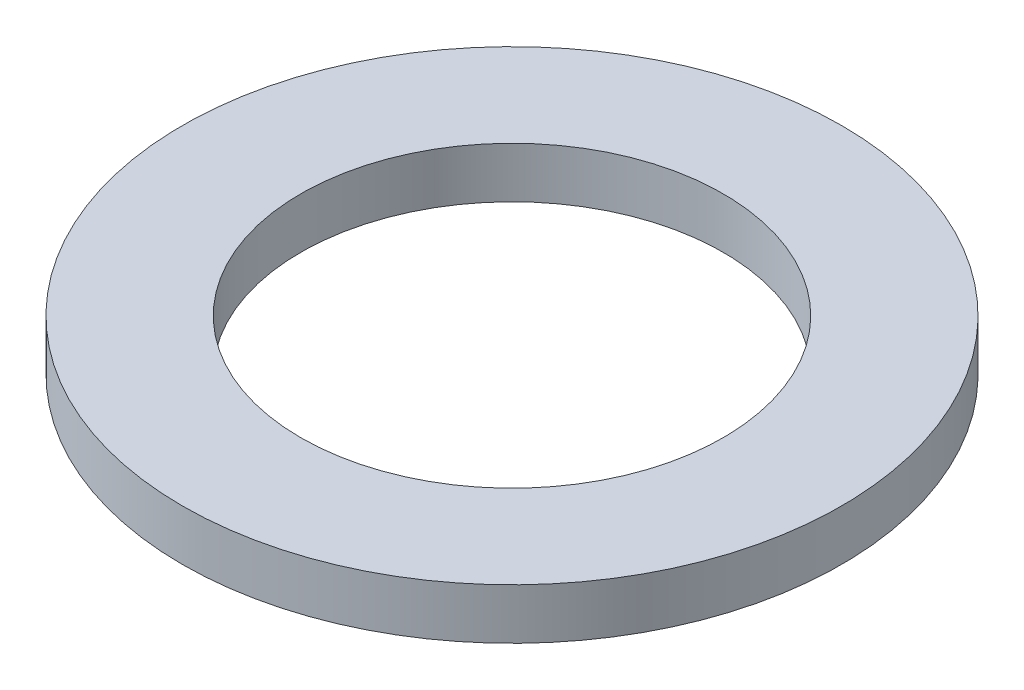
ISO-10303-21;
HEADER;
FILE_DESCRIPTION(('STEP AP214'),'2;1');
FILE_NAME('part.step','',(''),(''),'','','');
FILE_SCHEMA(('AUTOMOTIVE_DESIGN { 1 0 10303 214 1 1 1 1 }'));
ENDSEC;
DATA;
#1=APPLICATION_CONTEXT('core data for automotive mechanical design processes');
#2=APPLICATION_PROTOCOL_DEFINITION('international standard','automotive_design',2000,#1);
#3=PRODUCT_CONTEXT('',#1,'mechanical');
#4=PRODUCT('Part','Part','',(#3));
#5=PRODUCT_RELATED_PRODUCT_CATEGORY('part','',(#4));
#6=PRODUCT_DEFINITION_FORMATION('','',#4);
#7=PRODUCT_DEFINITION_CONTEXT('part definition',#1,'design');
#8=PRODUCT_DEFINITION('design','',#6,#7);
#9=PRODUCT_DEFINITION_SHAPE('','',#8);
#10=(LENGTH_UNIT() NAMED_UNIT(*) SI_UNIT(.MILLI.,.METRE.));
#11=(NAMED_UNIT(*) PLANE_ANGLE_UNIT() SI_UNIT($,.RADIAN.));
#12=(NAMED_UNIT(*) SI_UNIT($,.STERADIAN.) SOLID_ANGLE_UNIT());
#13=UNCERTAINTY_MEASURE_WITH_UNIT(LENGTH_MEASURE(1.E-05),#10,'distance_accuracy_value','');
#14=(GEOMETRIC_REPRESENTATION_CONTEXT(3) GLOBAL_UNCERTAINTY_ASSIGNED_CONTEXT((#13)) GLOBAL_UNIT_ASSIGNED_CONTEXT((#10,
#11,#12)) REPRESENTATION_CONTEXT('',''));
#15=CARTESIAN_POINT('',(0.,0.,0.));
#16=DIRECTION('',(0.,0.,1.));
#17=DIRECTION('',(1.,0.,0.));
#18=AXIS2_PLACEMENT_3D('',#15,#16,#17);
#19=CARTESIAN_POINT('',(0.,3.,0.));
#20=DIRECTION('',(0.,1.,0.));
#21=DIRECTION('',(0.,0.,1.));
#22=AXIS2_PLACEMENT_3D('',#19,#20,#21);
#23=PLANE('',#22);
#24=CARTESIAN_POINT('',(0.,3.,0.));
#25=DIRECTION('',(0.,1.,0.));
#26=DIRECTION('',(0.,0.,1.));
#27=AXIS2_PLACEMENT_3D('',#24,#25,#26);
#28=CIRCLE('',#27,19.5);
#29=CARTESIAN_POINT('',(0.,3.,19.5));
#30=VERTEX_POINT('',#29);
#31=EDGE_CURVE('E10',#30,#30,#28,.T.);
#32=ORIENTED_EDGE('',*,*,#31,.T.);
#33=EDGE_LOOP('',(#32));
#34=FACE_BOUND('',#33,.T.);
#35=CARTESIAN_POINT('',(0.,3.,0.));
#36=DIRECTION('',(0.,1.,0.));
#37=DIRECTION('',(0.,0.,1.));
#38=AXIS2_PLACEMENT_3D('',#35,#36,#37);
#39=CIRCLE('',#38,12.5);
#40=CARTESIAN_POINT('',(0.,3.,12.5));
#41=VERTEX_POINT('',#40);
#42=EDGE_CURVE('E54',#41,#41,#39,.T.);
#43=ORIENTED_EDGE('',*,*,#42,.F.);
#44=EDGE_LOOP('',(#43));
#45=FACE_BOUND('',#44,.T.);
#46=ADVANCED_FACE('F41',(#34,#45),#23,.T.);
#47=CARTESIAN_POINT('',(0.,0.,0.));
#48=DIRECTION('',(0.,1.,0.));
#49=DIRECTION('',(0.,0.,1.));
#50=AXIS2_PLACEMENT_3D('',#47,#48,#49);
#51=PLANE('',#50);
#52=CARTESIAN_POINT('',(0.,0.,0.));
#53=DIRECTION('',(0.,1.,0.));
#54=DIRECTION('',(0.,0.,1.));
#55=AXIS2_PLACEMENT_3D('',#52,#53,#54);
#56=CIRCLE('',#55,19.5);
#57=CARTESIAN_POINT('',(0.,0.,19.5));
#58=VERTEX_POINT('',#57);
#59=EDGE_CURVE('E45',#58,#58,#56,.T.);
#60=ORIENTED_EDGE('',*,*,#59,.F.);
#61=EDGE_LOOP('',(#60));
#62=FACE_BOUND('',#61,.T.);
#63=CARTESIAN_POINT('',(0.,0.,0.));
#64=DIRECTION('',(0.,1.,0.));
#65=DIRECTION('',(0.,0.,1.));
#66=AXIS2_PLACEMENT_3D('',#63,#64,#65);
#67=CIRCLE('',#66,12.5);
#68=CARTESIAN_POINT('',(0.,0.,12.5));
#69=VERTEX_POINT('',#68);
#70=EDGE_CURVE('E56',#69,#69,#67,.T.);
#71=ORIENTED_EDGE('',*,*,#70,.T.);
#72=EDGE_LOOP('',(#71));
#73=FACE_BOUND('',#72,.T.);
#74=ADVANCED_FACE('F68',(#62,#73),#51,.F.);
#75=CARTESIAN_POINT('',(0.,3.,0.));
#76=DIRECTION('',(0.,-1.,0.));
#77=DIRECTION('',(0.,0.,-1.));
#78=AXIS2_PLACEMENT_3D('',#75,#76,#77);
#79=CYLINDRICAL_SURFACE('',#78,19.5);
#80=ORIENTED_EDGE('',*,*,#31,.F.);
#81=EDGE_LOOP('',(#80));
#82=FACE_BOUND('',#81,.T.);
#83=ORIENTED_EDGE('',*,*,#59,.T.);
#84=EDGE_LOOP('',(#83));
#85=FACE_BOUND('',#84,.T.);
#86=ADVANCED_FACE('F43',(#82,#85),#79,.T.);
#87=CARTESIAN_POINT('',(0.,3.,0.));
#88=DIRECTION('',(0.,-1.,0.));
#89=DIRECTION('',(0.,0.,-1.));
#90=AXIS2_PLACEMENT_3D('',#87,#88,#89);
#91=CYLINDRICAL_SURFACE('',#90,12.5);
#92=ORIENTED_EDGE('',*,*,#42,.T.);
#93=EDGE_LOOP('',(#92));
#94=FACE_BOUND('',#93,.T.);
#95=ORIENTED_EDGE('',*,*,#70,.F.);
#96=EDGE_LOOP('',(#95));
#97=FACE_BOUND('',#96,.T.);
#98=ADVANCED_FACE('F64',(#94,#97),#91,.F.);
#99=CLOSED_SHELL('',(#46,#74,#86,#98));
#100=MANIFOLD_SOLID_BREP('B2',#99);
#101=ADVANCED_BREP_SHAPE_REPRESENTATION('',(#18,#100),#14);
#102=SHAPE_DEFINITION_REPRESENTATION(#9,#101);
ENDSEC;
END-ISO-10303-21;
